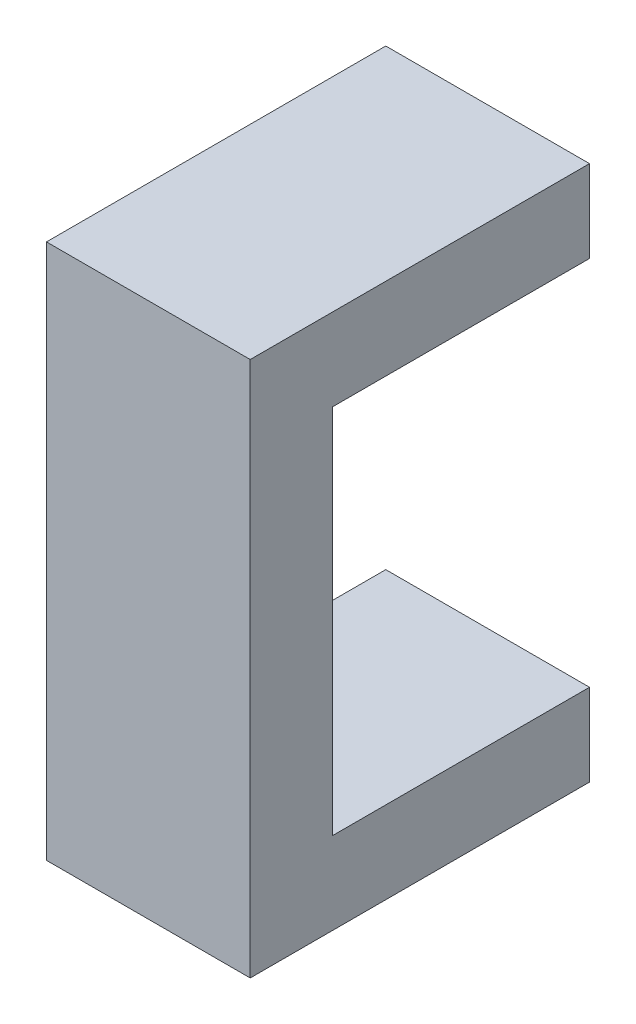
ISO-10303-21;
HEADER;
FILE_DESCRIPTION(('STEP AP214'),'2;1');
FILE_NAME('part.step','',(''),(''),'','','');
FILE_SCHEMA(('AUTOMOTIVE_DESIGN { 1 0 10303 214 1 1 1 1 }'));
ENDSEC;
DATA;
#1=APPLICATION_CONTEXT('core data for automotive mechanical design processes');
#2=APPLICATION_PROTOCOL_DEFINITION('international standard','automotive_design',2000,#1);
#3=PRODUCT_CONTEXT('',#1,'mechanical');
#4=PRODUCT('Part','Part','',(#3));
#5=PRODUCT_RELATED_PRODUCT_CATEGORY('part','',(#4));
#6=PRODUCT_DEFINITION_FORMATION('','',#4);
#7=PRODUCT_DEFINITION_CONTEXT('part definition',#1,'design');
#8=PRODUCT_DEFINITION('design','',#6,#7);
#9=PRODUCT_DEFINITION_SHAPE('','',#8);
#10=(LENGTH_UNIT() NAMED_UNIT(*) SI_UNIT(.MILLI.,.METRE.));
#11=(NAMED_UNIT(*) PLANE_ANGLE_UNIT() SI_UNIT($,.RADIAN.));
#12=(NAMED_UNIT(*) SI_UNIT($,.STERADIAN.) SOLID_ANGLE_UNIT());
#13=UNCERTAINTY_MEASURE_WITH_UNIT(LENGTH_MEASURE(1.E-05),#10,'distance_accuracy_value','');
#14=(GEOMETRIC_REPRESENTATION_CONTEXT(3) GLOBAL_UNCERTAINTY_ASSIGNED_CONTEXT((#13)) GLOBAL_UNIT_ASSIGNED_CONTEXT((#10,
#11,#12)) REPRESENTATION_CONTEXT('',''));
#15=CARTESIAN_POINT('',(0.,0.,0.));
#16=DIRECTION('',(0.,0.,1.));
#17=DIRECTION('',(1.,0.,0.));
#18=AXIS2_PLACEMENT_3D('',#15,#16,#17);
#19=CARTESIAN_POINT('',(12.4,0.,-18.15));
#20=DIRECTION('',(0.,0.,-1.));
#21=DIRECTION('',(-1.,0.,0.));
#22=AXIS2_PLACEMENT_3D('',#19,#20,#21);
#23=PLANE('',#22);
#24=DIRECTION('',(0.,-1.,0.));
#25=VECTOR('',#24,1.);
#26=CARTESIAN_POINT('',(0.,0.,-18.15));
#27=LINE('',#26,#25);
#28=CARTESIAN_POINT('',(0.,16.3,-18.15));
#29=VERTEX_POINT('',#28);
#30=CARTESIAN_POINT('',(0.,11.3,-18.15));
#31=VERTEX_POINT('',#30);
#32=EDGE_CURVE('E125',#29,#31,#27,.T.);
#33=ORIENTED_EDGE('',*,*,#32,.F.);
#34=DIRECTION('',(-1.,0.,0.));
#35=VECTOR('',#34,1.);
#36=CARTESIAN_POINT('',(12.4,16.3,-18.15));
#37=LINE('',#36,#35);
#38=CARTESIAN_POINT('',(12.4,16.3,-18.15));
#39=VERTEX_POINT('',#38);
#40=EDGE_CURVE('E11',#39,#29,#37,.T.);
#41=ORIENTED_EDGE('',*,*,#40,.F.);
#42=DIRECTION('',(0.,-1.,0.));
#43=VECTOR('',#42,1.);
#44=CARTESIAN_POINT('',(12.4,0.,-18.15));
#45=LINE('',#44,#43);
#46=CARTESIAN_POINT('',(12.4,11.3,-18.15));
#47=VERTEX_POINT('',#46);
#48=EDGE_CURVE('E145',#39,#47,#45,.T.);
#49=ORIENTED_EDGE('',*,*,#48,.T.);
#50=DIRECTION('',(-1.,0.,0.));
#51=VECTOR('',#50,1.);
#52=CARTESIAN_POINT('',(12.4,11.3,-18.15));
#53=LINE('',#52,#51);
#54=EDGE_CURVE('E82',#47,#31,#53,.T.);
#55=ORIENTED_EDGE('',*,*,#54,.T.);
#56=EDGE_LOOP('',(#33,#41,#49,#55));
#57=FACE_BOUND('',#56,.T.);
#58=ADVANCED_FACE('F32',(#57),#23,.T.);
#59=CARTESIAN_POINT('',(12.4,16.3,0.));
#60=DIRECTION('',(0.,1.,0.));
#61=DIRECTION('',(0.,0.,1.));
#62=AXIS2_PLACEMENT_3D('',#59,#60,#61);
#63=PLANE('',#62);
#64=DIRECTION('',(0.,0.,-1.));
#65=VECTOR('',#64,1.);
#66=CARTESIAN_POINT('',(0.,16.3,0.));
#67=LINE('',#66,#65);
#68=CARTESIAN_POINT('',(0.,16.3,2.5));
#69=VERTEX_POINT('',#68);
#70=EDGE_CURVE('E128',#69,#29,#67,.T.);
#71=ORIENTED_EDGE('',*,*,#70,.F.);
#72=DIRECTION('',(-1.,0.,0.));
#73=VECTOR('',#72,1.);
#74=CARTESIAN_POINT('',(12.4,16.3,2.5));
#75=LINE('',#74,#73);
#76=CARTESIAN_POINT('',(12.4,16.3,2.5));
#77=VERTEX_POINT('',#76);
#78=EDGE_CURVE('E40',#77,#69,#75,.T.);
#79=ORIENTED_EDGE('',*,*,#78,.F.);
#80=DIRECTION('',(0.,0.,-1.));
#81=VECTOR('',#80,1.);
#82=CARTESIAN_POINT('',(12.4,16.3,0.));
#83=LINE('',#82,#81);
#84=EDGE_CURVE('E167',#77,#39,#83,.T.);
#85=ORIENTED_EDGE('',*,*,#84,.T.);
#86=ORIENTED_EDGE('',*,*,#40,.T.);
#87=EDGE_LOOP('',(#71,#79,#85,#86));
#88=FACE_BOUND('',#87,.T.);
#89=ADVANCED_FACE('F166',(#88),#63,.T.);
#90=CARTESIAN_POINT('',(12.4,0.,2.5));
#91=DIRECTION('',(0.,0.,-1.));
#92=DIRECTION('',(0.,1.,0.));
#93=AXIS2_PLACEMENT_3D('',#90,#91,#92);
#94=PLANE('',#93);
#95=DIRECTION('',(0.,-1.,0.));
#96=VECTOR('',#95,1.);
#97=CARTESIAN_POINT('',(0.,0.,2.5));
#98=LINE('',#97,#96);
#99=CARTESIAN_POINT('',(0.,-16.3,2.5));
#100=VERTEX_POINT('',#99);
#101=EDGE_CURVE('E131',#69,#100,#98,.T.);
#102=ORIENTED_EDGE('',*,*,#101,.T.);
#103=DIRECTION('',(-1.,0.,0.));
#104=VECTOR('',#103,1.);
#105=CARTESIAN_POINT('',(12.4,-16.3,2.5));
#106=LINE('',#105,#104);
#107=CARTESIAN_POINT('',(12.4,-16.3,2.5));
#108=VERTEX_POINT('',#107);
#109=EDGE_CURVE('E151',#108,#100,#106,.T.);
#110=ORIENTED_EDGE('',*,*,#109,.F.);
#111=DIRECTION('',(0.,-1.,0.));
#112=VECTOR('',#111,1.);
#113=CARTESIAN_POINT('',(12.4,0.,2.5));
#114=LINE('',#113,#112);
#115=EDGE_CURVE('E157',#77,#108,#114,.T.);
#116=ORIENTED_EDGE('',*,*,#115,.F.);
#117=ORIENTED_EDGE('',*,*,#78,.T.);
#118=EDGE_LOOP('',(#102,#110,#116,#117));
#119=FACE_BOUND('',#118,.T.);
#120=ADVANCED_FACE('F155',(#119),#94,.F.);
#121=CARTESIAN_POINT('',(12.4,-16.3,0.));
#122=DIRECTION('',(0.,-1.,0.));
#123=DIRECTION('',(0.,0.,-1.));
#124=AXIS2_PLACEMENT_3D('',#121,#122,#123);
#125=PLANE('',#124);
#126=DIRECTION('',(0.,0.,1.));
#127=VECTOR('',#126,1.);
#128=CARTESIAN_POINT('',(0.,-16.3,0.));
#129=LINE('',#128,#127);
#130=CARTESIAN_POINT('',(0.,-16.3,-18.15));
#131=VERTEX_POINT('',#130);
#132=EDGE_CURVE('E134',#131,#100,#129,.T.);
#133=ORIENTED_EDGE('',*,*,#132,.F.);
#134=DIRECTION('',(-1.,0.,0.));
#135=VECTOR('',#134,1.);
#136=CARTESIAN_POINT('',(12.4,-16.3,-18.15));
#137=LINE('',#136,#135);
#138=CARTESIAN_POINT('',(12.4,-16.3,-18.15));
#139=VERTEX_POINT('',#138);
#140=EDGE_CURVE('E149',#139,#131,#137,.T.);
#141=ORIENTED_EDGE('',*,*,#140,.F.);
#142=DIRECTION('',(0.,0.,1.));
#143=VECTOR('',#142,1.);
#144=CARTESIAN_POINT('',(12.4,-16.3,0.));
#145=LINE('',#144,#143);
#146=EDGE_CURVE('E173',#139,#108,#145,.T.);
#147=ORIENTED_EDGE('',*,*,#146,.T.);
#148=ORIENTED_EDGE('',*,*,#109,.T.);
#149=EDGE_LOOP('',(#133,#141,#147,#148));
#150=FACE_BOUND('',#149,.T.);
#151=ADVANCED_FACE('F176',(#150),#125,.T.);
#152=CARTESIAN_POINT('',(12.4,0.,-18.15));
#153=DIRECTION('',(0.,0.,1.));
#154=DIRECTION('',(1.,0.,0.));
#155=AXIS2_PLACEMENT_3D('',#152,#153,#154);
#156=PLANE('',#155);
#157=DIRECTION('',(0.,1.,0.));
#158=VECTOR('',#157,1.);
#159=CARTESIAN_POINT('',(0.,0.,-18.15));
#160=LINE('',#159,#158);
#161=CARTESIAN_POINT('',(0.,-11.3,-18.15));
#162=VERTEX_POINT('',#161);
#163=EDGE_CURVE('E137',#131,#162,#160,.T.);
#164=ORIENTED_EDGE('',*,*,#163,.T.);
#165=DIRECTION('',(-1.,0.,0.));
#166=VECTOR('',#165,1.);
#167=CARTESIAN_POINT('',(12.4,-11.3,-18.15));
#168=LINE('',#167,#166);
#169=CARTESIAN_POINT('',(12.4,-11.3,-18.15));
#170=VERTEX_POINT('',#169);
#171=EDGE_CURVE('E111',#170,#162,#168,.T.);
#172=ORIENTED_EDGE('',*,*,#171,.F.);
#173=DIRECTION('',(0.,1.,0.));
#174=VECTOR('',#173,1.);
#175=CARTESIAN_POINT('',(12.4,0.,-18.15));
#176=LINE('',#175,#174);
#177=EDGE_CURVE('E117',#139,#170,#176,.T.);
#178=ORIENTED_EDGE('',*,*,#177,.F.);
#179=ORIENTED_EDGE('',*,*,#140,.T.);
#180=EDGE_LOOP('',(#164,#172,#178,#179));
#181=FACE_BOUND('',#180,.T.);
#182=ADVANCED_FACE('F178',(#181),#156,.F.);
#183=CARTESIAN_POINT('',(12.4,-11.3,0.));
#184=DIRECTION('',(0.,1.,0.));
#185=DIRECTION('',(0.,0.,1.));
#186=AXIS2_PLACEMENT_3D('',#183,#184,#185);
#187=PLANE('',#186);
#188=DIRECTION('',(0.,0.,-1.));
#189=VECTOR('',#188,1.);
#190=CARTESIAN_POINT('',(0.,-11.3,0.));
#191=LINE('',#190,#189);
#192=CARTESIAN_POINT('',(0.,-11.3,-2.5));
#193=VERTEX_POINT('',#192);
#194=EDGE_CURVE('E106',#193,#162,#191,.T.);
#195=ORIENTED_EDGE('',*,*,#194,.F.);
#196=DIRECTION('',(-1.,0.,0.));
#197=VECTOR('',#196,1.);
#198=CARTESIAN_POINT('',(12.4,-11.3,-2.5));
#199=LINE('',#198,#197);
#200=CARTESIAN_POINT('',(12.4,-11.3,-2.5));
#201=VERTEX_POINT('',#200);
#202=EDGE_CURVE('E101',#201,#193,#199,.T.);
#203=ORIENTED_EDGE('',*,*,#202,.F.);
#204=DIRECTION('',(0.,0.,-1.));
#205=VECTOR('',#204,1.);
#206=CARTESIAN_POINT('',(12.4,-11.3,0.));
#207=LINE('',#206,#205);
#208=EDGE_CURVE('E104',#201,#170,#207,.T.);
#209=ORIENTED_EDGE('',*,*,#208,.T.);
#210=ORIENTED_EDGE('',*,*,#171,.T.);
#211=EDGE_LOOP('',(#195,#203,#209,#210));
#212=FACE_BOUND('',#211,.T.);
#213=ADVANCED_FACE('F103',(#212),#187,.T.);
#214=CARTESIAN_POINT('',(12.4,0.,-2.5));
#215=DIRECTION('',(0.,0.,-1.));
#216=DIRECTION('',(0.,1.,0.));
#217=AXIS2_PLACEMENT_3D('',#214,#215,#216);
#218=PLANE('',#217);
#219=DIRECTION('',(0.,-1.,0.));
#220=VECTOR('',#219,1.);
#221=CARTESIAN_POINT('',(0.,0.,-2.5));
#222=LINE('',#221,#220);
#223=CARTESIAN_POINT('',(0.,11.3,-2.5));
#224=VERTEX_POINT('',#223);
#225=EDGE_CURVE('E141',#224,#193,#222,.T.);
#226=ORIENTED_EDGE('',*,*,#225,.F.);
#227=DIRECTION('',(-1.,0.,0.));
#228=VECTOR('',#227,1.);
#229=CARTESIAN_POINT('',(12.4,11.3,-2.5));
#230=LINE('',#229,#228);
#231=CARTESIAN_POINT('',(12.4,11.3,-2.5));
#232=VERTEX_POINT('',#231);
#233=EDGE_CURVE('E75',#232,#224,#230,.T.);
#234=ORIENTED_EDGE('',*,*,#233,.F.);
#235=DIRECTION('',(0.,-1.,0.));
#236=VECTOR('',#235,1.);
#237=CARTESIAN_POINT('',(12.4,0.,-2.5));
#238=LINE('',#237,#236);
#239=EDGE_CURVE('E114',#232,#201,#238,.T.);
#240=ORIENTED_EDGE('',*,*,#239,.T.);
#241=ORIENTED_EDGE('',*,*,#202,.T.);
#242=EDGE_LOOP('',(#226,#234,#240,#241));
#243=FACE_BOUND('',#242,.T.);
#244=ADVANCED_FACE('F120',(#243),#218,.T.);
#245=CARTESIAN_POINT('',(12.4,11.3,0.));
#246=DIRECTION('',(0.,1.,0.));
#247=DIRECTION('',(0.,0.,1.));
#248=AXIS2_PLACEMENT_3D('',#245,#246,#247);
#249=PLANE('',#248);
#250=DIRECTION('',(0.,0.,-1.));
#251=VECTOR('',#250,1.);
#252=CARTESIAN_POINT('',(0.,11.3,0.));
#253=LINE('',#252,#251);
#254=EDGE_CURVE('E143',#224,#31,#253,.T.);
#255=ORIENTED_EDGE('',*,*,#254,.T.);
#256=ORIENTED_EDGE('',*,*,#54,.F.);
#257=DIRECTION('',(0.,0.,-1.));
#258=VECTOR('',#257,1.);
#259=CARTESIAN_POINT('',(12.4,11.3,0.));
#260=LINE('',#259,#258);
#261=EDGE_CURVE('E48',#232,#47,#260,.T.);
#262=ORIENTED_EDGE('',*,*,#261,.F.);
#263=ORIENTED_EDGE('',*,*,#233,.T.);
#264=EDGE_LOOP('',(#255,#256,#262,#263));
#265=FACE_BOUND('',#264,.T.);
#266=ADVANCED_FACE('F168',(#265),#249,.F.);
#267=CARTESIAN_POINT('',(12.4,0.,0.));
#268=DIRECTION('',(1.,0.,0.));
#269=DIRECTION('',(0.,0.,-1.));
#270=AXIS2_PLACEMENT_3D('',#267,#268,#269);
#271=PLANE('',#270);
#272=ORIENTED_EDGE('',*,*,#48,.F.);
#273=ORIENTED_EDGE('',*,*,#84,.F.);
#274=ORIENTED_EDGE('',*,*,#115,.T.);
#275=ORIENTED_EDGE('',*,*,#146,.F.);
#276=ORIENTED_EDGE('',*,*,#177,.T.);
#277=ORIENTED_EDGE('',*,*,#208,.F.);
#278=ORIENTED_EDGE('',*,*,#239,.F.);
#279=ORIENTED_EDGE('',*,*,#261,.T.);
#280=EDGE_LOOP('',(#272,#273,#274,#275,#276,#277,#278,#279));
#281=FACE_BOUND('',#280,.T.);
#282=ADVANCED_FACE('F113',(#281),#271,.T.);
#283=CARTESIAN_POINT('',(0.,0.,0.));
#284=DIRECTION('',(1.,0.,0.));
#285=DIRECTION('',(0.,0.,-1.));
#286=AXIS2_PLACEMENT_3D('',#283,#284,#285);
#287=PLANE('',#286);
#288=ORIENTED_EDGE('',*,*,#32,.T.);
#289=ORIENTED_EDGE('',*,*,#254,.F.);
#290=ORIENTED_EDGE('',*,*,#225,.T.);
#291=ORIENTED_EDGE('',*,*,#194,.T.);
#292=ORIENTED_EDGE('',*,*,#163,.F.);
#293=ORIENTED_EDGE('',*,*,#132,.T.);
#294=ORIENTED_EDGE('',*,*,#101,.F.);
#295=ORIENTED_EDGE('',*,*,#70,.T.);
#296=EDGE_LOOP('',(#288,#289,#290,#291,#292,#293,#294,#295));
#297=FACE_BOUND('',#296,.T.);
#298=ADVANCED_FACE('F163',(#297),#287,.F.);
#299=CLOSED_SHELL('',(#58,#89,#120,#151,#182,#213,#244,#266,#282,#298));
#300=MANIFOLD_SOLID_BREP('B2',#299);
#301=ADVANCED_BREP_SHAPE_REPRESENTATION('',(#18,#300),#14);
#302=SHAPE_DEFINITION_REPRESENTATION(#9,#301);
ENDSEC;
END-ISO-10303-21;
